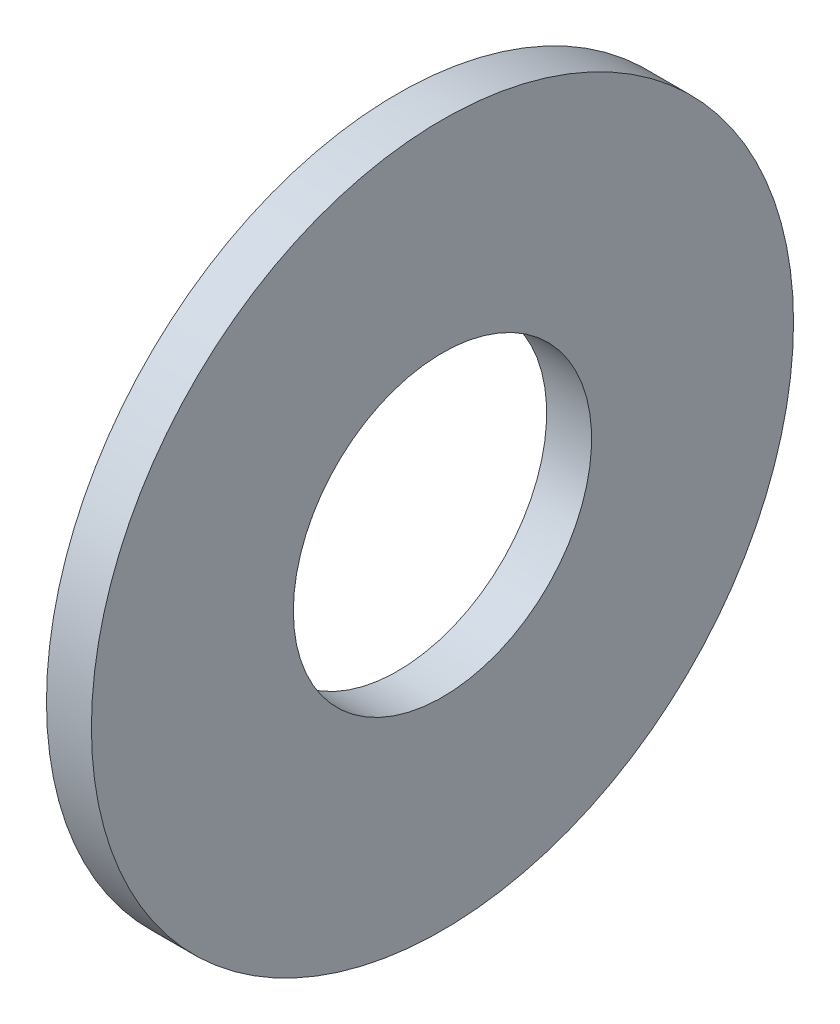
ISO-10303-21;
HEADER;
FILE_DESCRIPTION(('STEP AP214'),'2;1');
FILE_NAME('part.step','',(''),(''),'','','');
FILE_SCHEMA(('AUTOMOTIVE_DESIGN { 1 0 10303 214 1 1 1 1 }'));
ENDSEC;
DATA;
#1=APPLICATION_CONTEXT('core data for automotive mechanical design processes');
#2=APPLICATION_PROTOCOL_DEFINITION('international standard','automotive_design',2000,#1);
#3=PRODUCT_CONTEXT('',#1,'mechanical');
#4=PRODUCT('Part','Part','',(#3));
#5=PRODUCT_RELATED_PRODUCT_CATEGORY('part','',(#4));
#6=PRODUCT_DEFINITION_FORMATION('','',#4);
#7=PRODUCT_DEFINITION_CONTEXT('part definition',#1,'design');
#8=PRODUCT_DEFINITION('design','',#6,#7);
#9=PRODUCT_DEFINITION_SHAPE('','',#8);
#10=(LENGTH_UNIT() NAMED_UNIT(*) SI_UNIT(.MILLI.,.METRE.));
#11=(NAMED_UNIT(*) PLANE_ANGLE_UNIT() SI_UNIT($,.RADIAN.));
#12=(NAMED_UNIT(*) SI_UNIT($,.STERADIAN.) SOLID_ANGLE_UNIT());
#13=UNCERTAINTY_MEASURE_WITH_UNIT(LENGTH_MEASURE(1.E-05),#10,'distance_accuracy_value','');
#14=(GEOMETRIC_REPRESENTATION_CONTEXT(3) GLOBAL_UNCERTAINTY_ASSIGNED_CONTEXT((#13)) GLOBAL_UNIT_ASSIGNED_CONTEXT((#10,
#11,#12)) REPRESENTATION_CONTEXT('',''));
#15=CARTESIAN_POINT('',(0.,0.,0.));
#16=DIRECTION('',(0.,0.,1.));
#17=DIRECTION('',(1.,0.,0.));
#18=AXIS2_PLACEMENT_3D('',#15,#16,#17);
#19=CARTESIAN_POINT('',(-34.9249999999999,0.,0.));
#20=DIRECTION('',(-1.,0.,0.));
#21=DIRECTION('',(0.,0.,1.));
#22=AXIS2_PLACEMENT_3D('',#19,#20,#21);
#23=CYLINDRICAL_SURFACE('',#22,13.4874);
#24=CARTESIAN_POINT('',(0.,0.,0.));
#25=DIRECTION('',(-1.,0.,0.));
#26=DIRECTION('',(0.,0.,1.));
#27=AXIS2_PLACEMENT_3D('',#24,#25,#26);
#28=CIRCLE('',#27,13.4874);
#29=CARTESIAN_POINT('',(0.,0.,13.4874));
#30=VERTEX_POINT('',#29);
#31=EDGE_CURVE('E10',#30,#30,#28,.T.);
#32=ORIENTED_EDGE('',*,*,#31,.F.);
#33=EDGE_LOOP('',(#32));
#34=FACE_BOUND('',#33,.T.);
#35=CARTESIAN_POINT('',(-4.06399999999999,0.,0.));
#36=DIRECTION('',(-1.,0.,0.));
#37=DIRECTION('',(0.,0.,1.));
#38=AXIS2_PLACEMENT_3D('',#35,#36,#37);
#39=CIRCLE('',#38,13.4874);
#40=CARTESIAN_POINT('',(-4.06399999999999,0.,13.4874));
#41=VERTEX_POINT('',#40);
#42=EDGE_CURVE('E44',#41,#41,#39,.T.);
#43=ORIENTED_EDGE('',*,*,#42,.T.);
#44=EDGE_LOOP('',(#43));
#45=FACE_BOUND('',#44,.T.);
#46=ADVANCED_FACE('F30',(#34,#45),#23,.F.);
#47=CARTESIAN_POINT('',(0.,13.4874,0.));
#48=DIRECTION('',(-1.,0.,0.));
#49=DIRECTION('',(0.,0.,1.));
#50=AXIS2_PLACEMENT_3D('',#47,#48,#49);
#51=PLANE('',#50);
#52=CARTESIAN_POINT('',(0.,0.,0.));
#53=DIRECTION('',(-1.,0.,0.));
#54=DIRECTION('',(0.,0.,1.));
#55=AXIS2_PLACEMENT_3D('',#52,#53,#54);
#56=CIRCLE('',#55,31.75);
#57=CARTESIAN_POINT('',(0.,0.,31.75));
#58=VERTEX_POINT('',#57);
#59=EDGE_CURVE('E36',#58,#58,#56,.T.);
#60=ORIENTED_EDGE('',*,*,#59,.F.);
#61=EDGE_LOOP('',(#60));
#62=FACE_BOUND('',#61,.T.);
#63=ORIENTED_EDGE('',*,*,#31,.T.);
#64=EDGE_LOOP('',(#63));
#65=FACE_BOUND('',#64,.T.);
#66=ADVANCED_FACE('F59',(#62,#65),#51,.F.);
#67=CARTESIAN_POINT('',(-34.9249999999999,0.,0.));
#68=DIRECTION('',(-1.,0.,0.));
#69=DIRECTION('',(0.,0.,1.));
#70=AXIS2_PLACEMENT_3D('',#67,#68,#69);
#71=CYLINDRICAL_SURFACE('',#70,31.75);
#72=CARTESIAN_POINT('',(-4.064,0.,0.));
#73=DIRECTION('',(-1.,0.,0.));
#74=DIRECTION('',(0.,0.,1.));
#75=AXIS2_PLACEMENT_3D('',#72,#73,#74);
#76=CIRCLE('',#75,31.75);
#77=CARTESIAN_POINT('',(-4.064,0.,31.75));
#78=VERTEX_POINT('',#77);
#79=EDGE_CURVE('E40',#78,#78,#76,.T.);
#80=ORIENTED_EDGE('',*,*,#79,.F.);
#81=EDGE_LOOP('',(#80));
#82=FACE_BOUND('',#81,.T.);
#83=ORIENTED_EDGE('',*,*,#59,.T.);
#84=EDGE_LOOP('',(#83));
#85=FACE_BOUND('',#84,.T.);
#86=ADVANCED_FACE('F54',(#82,#85),#71,.T.);
#87=CARTESIAN_POINT('',(-4.064,31.75,0.));
#88=DIRECTION('',(1.,0.,0.));
#89=DIRECTION('',(0.,0.,-1.));
#90=AXIS2_PLACEMENT_3D('',#87,#88,#89);
#91=PLANE('',#90);
#92=ORIENTED_EDGE('',*,*,#42,.F.);
#93=EDGE_LOOP('',(#92));
#94=FACE_BOUND('',#93,.T.);
#95=ORIENTED_EDGE('',*,*,#79,.T.);
#96=EDGE_LOOP('',(#95));
#97=FACE_BOUND('',#96,.T.);
#98=ADVANCED_FACE('F51',(#94,#97),#91,.F.);
#99=CLOSED_SHELL('',(#46,#66,#86,#98));
#100=MANIFOLD_SOLID_BREP('B2',#99);
#101=ADVANCED_BREP_SHAPE_REPRESENTATION('',(#18,#100),#14);
#102=SHAPE_DEFINITION_REPRESENTATION(#9,#101);
ENDSEC;
END-ISO-10303-21;
